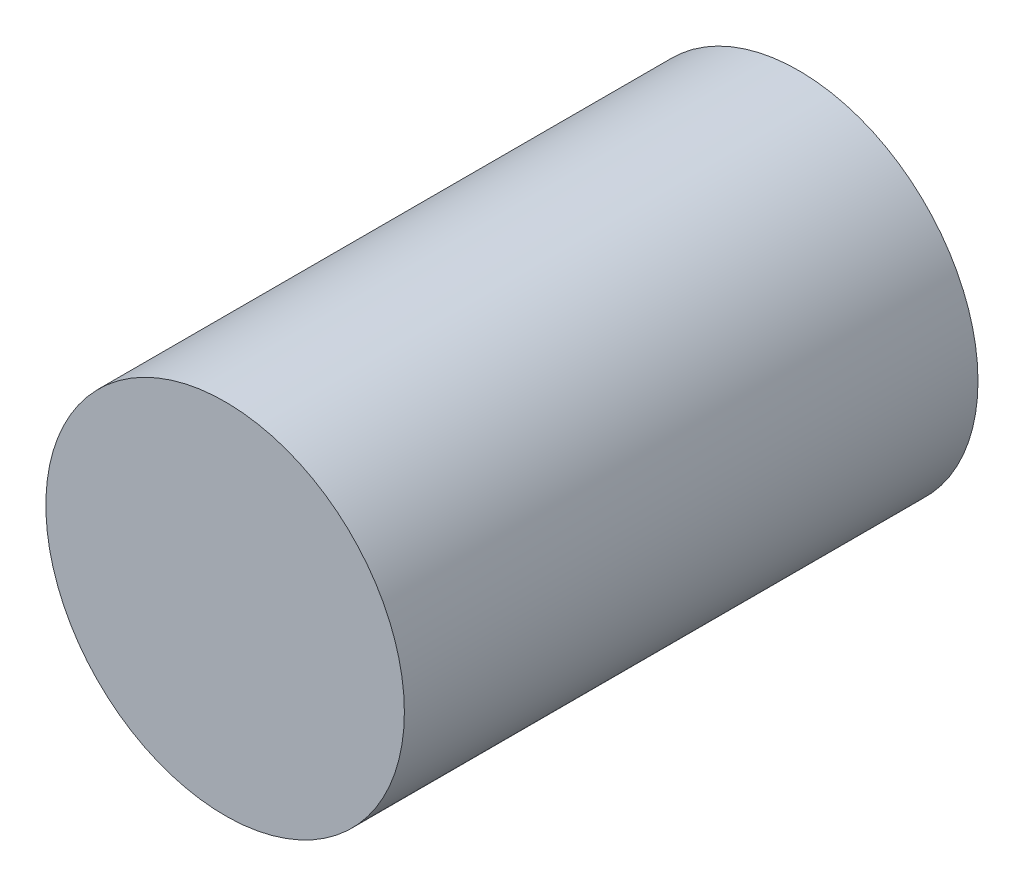
ISO-10303-21;
HEADER;
FILE_DESCRIPTION(('STEP AP214'),'2;1');
FILE_NAME('part.step','',(''),(''),'','','');
FILE_SCHEMA(('AUTOMOTIVE_DESIGN { 1 0 10303 214 1 1 1 1 }'));
ENDSEC;
DATA;
#1=APPLICATION_CONTEXT('core data for automotive mechanical design processes');
#2=APPLICATION_PROTOCOL_DEFINITION('international standard','automotive_design',2000,#1);
#3=PRODUCT_CONTEXT('',#1,'mechanical');
#4=PRODUCT('Part','Part','',(#3));
#5=PRODUCT_RELATED_PRODUCT_CATEGORY('part','',(#4));
#6=PRODUCT_DEFINITION_FORMATION('','',#4);
#7=PRODUCT_DEFINITION_CONTEXT('part definition',#1,'design');
#8=PRODUCT_DEFINITION('design','',#6,#7);
#9=PRODUCT_DEFINITION_SHAPE('','',#8);
#10=(LENGTH_UNIT() NAMED_UNIT(*) SI_UNIT(.MILLI.,.METRE.));
#11=(NAMED_UNIT(*) PLANE_ANGLE_UNIT() SI_UNIT($,.RADIAN.));
#12=(NAMED_UNIT(*) SI_UNIT($,.STERADIAN.) SOLID_ANGLE_UNIT());
#13=UNCERTAINTY_MEASURE_WITH_UNIT(LENGTH_MEASURE(1.E-05),#10,'distance_accuracy_value','');
#14=(GEOMETRIC_REPRESENTATION_CONTEXT(3) GLOBAL_UNCERTAINTY_ASSIGNED_CONTEXT((#13)) GLOBAL_UNIT_ASSIGNED_CONTEXT((#10,
#11,#12)) REPRESENTATION_CONTEXT('',''));
#15=CARTESIAN_POINT('',(0.,0.,0.));
#16=DIRECTION('',(0.,0.,1.));
#17=DIRECTION('',(1.,0.,0.));
#18=AXIS2_PLACEMENT_3D('',#15,#16,#17);
#19=CARTESIAN_POINT('',(0.,0.,5.08));
#20=DIRECTION('',(0.,0.,-1.));
#21=DIRECTION('',(-1.,0.,0.));
#22=AXIS2_PLACEMENT_3D('',#19,#20,#21);
#23=CYLINDRICAL_SURFACE('',#22,1.5875);
#24=CARTESIAN_POINT('',(0.,0.,5.08));
#25=DIRECTION('',(0.,0.,1.));
#26=DIRECTION('',(1.,0.,0.));
#27=AXIS2_PLACEMENT_3D('',#24,#25,#26);
#28=CIRCLE('',#27,1.5875);
#29=CARTESIAN_POINT('',(1.5875,0.,5.08));
#30=VERTEX_POINT('',#29);
#31=EDGE_CURVE('E10',#30,#30,#28,.T.);
#32=ORIENTED_EDGE('',*,*,#31,.F.);
#33=EDGE_LOOP('',(#32));
#34=FACE_BOUND('',#33,.T.);
#35=CARTESIAN_POINT('',(0.,0.,0.));
#36=DIRECTION('',(0.,0.,1.));
#37=DIRECTION('',(1.,0.,0.));
#38=AXIS2_PLACEMENT_3D('',#35,#36,#37);
#39=CIRCLE('',#38,1.5875);
#40=CARTESIAN_POINT('',(1.5875,0.,0.));
#41=VERTEX_POINT('',#40);
#42=EDGE_CURVE('E40',#41,#41,#39,.T.);
#43=ORIENTED_EDGE('',*,*,#42,.T.);
#44=EDGE_LOOP('',(#43));
#45=FACE_BOUND('',#44,.T.);
#46=ADVANCED_FACE('F37',(#34,#45),#23,.T.);
#47=CARTESIAN_POINT('',(0.,0.,5.08));
#48=DIRECTION('',(0.,0.,1.));
#49=DIRECTION('',(1.,0.,0.));
#50=AXIS2_PLACEMENT_3D('',#47,#48,#49);
#51=PLANE('',#50);
#52=ORIENTED_EDGE('',*,*,#31,.T.);
#53=EDGE_LOOP('',(#52));
#54=FACE_BOUND('',#53,.T.);
#55=ADVANCED_FACE('F54',(#54),#51,.T.);
#56=CARTESIAN_POINT('',(0.,0.,0.));
#57=DIRECTION('',(0.,0.,1.));
#58=DIRECTION('',(1.,0.,0.));
#59=AXIS2_PLACEMENT_3D('',#56,#57,#58);
#60=PLANE('',#59);
#61=ORIENTED_EDGE('',*,*,#42,.F.);
#62=EDGE_LOOP('',(#61));
#63=FACE_BOUND('',#62,.T.);
#64=ADVANCED_FACE('F52',(#63),#60,.F.);
#65=CLOSED_SHELL('',(#46,#55,#64));
#66=MANIFOLD_SOLID_BREP('B2',#65);
#67=ADVANCED_BREP_SHAPE_REPRESENTATION('',(#18,#66),#14);
#68=SHAPE_DEFINITION_REPRESENTATION(#9,#67);
ENDSEC;
END-ISO-10303-21;
